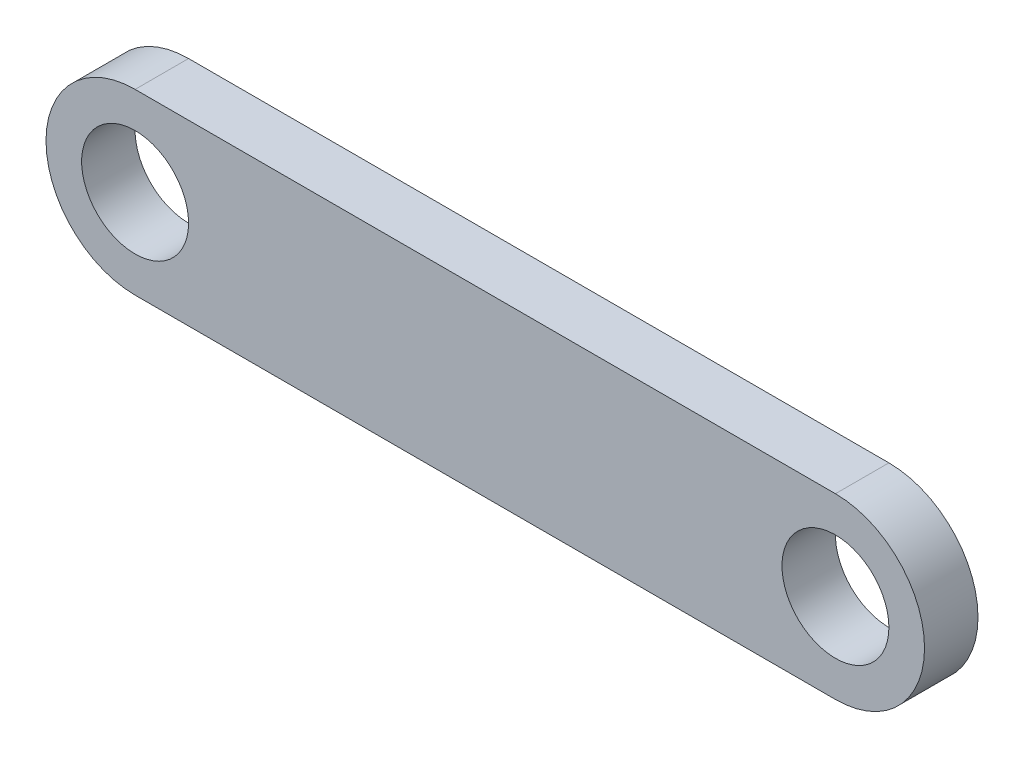
ISO-10303-21;
HEADER;
FILE_DESCRIPTION(('STEP AP214'),'2;1');
FILE_NAME('part.step','',(''),(''),'','','');
FILE_SCHEMA(('AUTOMOTIVE_DESIGN { 1 0 10303 214 1 1 1 1 }'));
ENDSEC;
DATA;
#1=APPLICATION_CONTEXT('core data for automotive mechanical design processes');
#2=APPLICATION_PROTOCOL_DEFINITION('international standard','automotive_design',2000,#1);
#3=PRODUCT_CONTEXT('',#1,'mechanical');
#4=PRODUCT('Part','Part','',(#3));
#5=PRODUCT_RELATED_PRODUCT_CATEGORY('part','',(#4));
#6=PRODUCT_DEFINITION_FORMATION('','',#4);
#7=PRODUCT_DEFINITION_CONTEXT('part definition',#1,'design');
#8=PRODUCT_DEFINITION('design','',#6,#7);
#9=PRODUCT_DEFINITION_SHAPE('','',#8);
#10=(LENGTH_UNIT() NAMED_UNIT(*) SI_UNIT(.MILLI.,.METRE.));
#11=(NAMED_UNIT(*) PLANE_ANGLE_UNIT() SI_UNIT($,.RADIAN.));
#12=(NAMED_UNIT(*) SI_UNIT($,.STERADIAN.) SOLID_ANGLE_UNIT());
#13=UNCERTAINTY_MEASURE_WITH_UNIT(LENGTH_MEASURE(1.E-05),#10,'distance_accuracy_value','');
#14=(GEOMETRIC_REPRESENTATION_CONTEXT(3) GLOBAL_UNCERTAINTY_ASSIGNED_CONTEXT((#13)) GLOBAL_UNIT_ASSIGNED_CONTEXT((#10,
#11,#12)) REPRESENTATION_CONTEXT('',''));
#15=CARTESIAN_POINT('',(0.,0.,0.));
#16=DIRECTION('',(0.,0.,1.));
#17=DIRECTION('',(1.,0.,0.));
#18=AXIS2_PLACEMENT_3D('',#15,#16,#17);
#19=CARTESIAN_POINT('',(-19.65,0.,3.));
#20=DIRECTION('',(0.,0.,1.));
#21=DIRECTION('',(1.,0.,0.));
#22=AXIS2_PLACEMENT_3D('',#19,#20,#21);
#23=PLANE('',#22);
#24=CARTESIAN_POINT('',(-19.65,0.,3.));
#25=DIRECTION('',(0.,0.,1.));
#26=DIRECTION('',(1.,0.,0.));
#27=AXIS2_PLACEMENT_3D('',#24,#25,#26);
#28=CIRCLE('',#27,3.);
#29=CARTESIAN_POINT('',(-16.65,0.,3.));
#30=VERTEX_POINT('',#29);
#31=EDGE_CURVE('E99',#30,#30,#28,.T.);
#32=ORIENTED_EDGE('',*,*,#31,.F.);
#33=EDGE_LOOP('',(#32));
#34=FACE_BOUND('',#33,.T.);
#35=CARTESIAN_POINT('',(-19.65,0.,3.));
#36=DIRECTION('',(0.,0.,1.));
#37=DIRECTION('',(1.,0.,0.));
#38=AXIS2_PLACEMENT_3D('',#35,#36,#37);
#39=CIRCLE('',#38,5.);
#40=CARTESIAN_POINT('',(-19.65,5.,3.));
#41=VERTEX_POINT('',#40);
#42=CARTESIAN_POINT('',(-19.65,-5.,3.));
#43=VERTEX_POINT('',#42);
#44=EDGE_CURVE('E84',#41,#43,#39,.T.);
#45=ORIENTED_EDGE('',*,*,#44,.T.);
#46=DIRECTION('',(1.,0.,0.));
#47=VECTOR('',#46,1.);
#48=CARTESIAN_POINT('',(-19.65,-5.,3.));
#49=LINE('',#48,#47);
#50=CARTESIAN_POINT('',(19.65,-4.99999999999999,3.));
#51=VERTEX_POINT('',#50);
#52=EDGE_CURVE('E79',#43,#51,#49,.T.);
#53=ORIENTED_EDGE('',*,*,#52,.T.);
#54=CARTESIAN_POINT('',(19.65,0.,3.));
#55=DIRECTION('',(0.,0.,1.));
#56=DIRECTION('',(1.,0.,0.));
#57=AXIS2_PLACEMENT_3D('',#54,#55,#56);
#58=CIRCLE('',#57,5.);
#59=CARTESIAN_POINT('',(19.65,5.00000000000001,3.));
#60=VERTEX_POINT('',#59);
#61=EDGE_CURVE('E82',#51,#60,#58,.T.);
#62=ORIENTED_EDGE('',*,*,#61,.T.);
#63=DIRECTION('',(-1.,0.,0.));
#64=VECTOR('',#63,1.);
#65=CARTESIAN_POINT('',(-19.65,5.,3.));
#66=LINE('',#65,#64);
#67=EDGE_CURVE('E49',#60,#41,#66,.T.);
#68=ORIENTED_EDGE('',*,*,#67,.T.);
#69=EDGE_LOOP('',(#45,#53,#62,#68));
#70=FACE_BOUND('',#69,.T.);
#71=CARTESIAN_POINT('',(19.65,0.,3.));
#72=DIRECTION('',(0.,0.,1.));
#73=DIRECTION('',(1.,0.,0.));
#74=AXIS2_PLACEMENT_3D('',#71,#72,#73);
#75=CIRCLE('',#74,2.99999999999999);
#76=CARTESIAN_POINT('',(22.65,0.,3.));
#77=VERTEX_POINT('',#76);
#78=EDGE_CURVE('E114',#77,#77,#75,.T.);
#79=ORIENTED_EDGE('',*,*,#78,.F.);
#80=EDGE_LOOP('',(#79));
#81=FACE_BOUND('',#80,.T.);
#82=ADVANCED_FACE('F32',(#34,#70,#81),#23,.T.);
#83=CARTESIAN_POINT('',(-19.65,0.,0.));
#84=DIRECTION('',(0.,0.,1.));
#85=DIRECTION('',(1.,0.,0.));
#86=AXIS2_PLACEMENT_3D('',#83,#84,#85);
#87=PLANE('',#86);
#88=CARTESIAN_POINT('',(-19.65,0.,0.));
#89=DIRECTION('',(0.,0.,1.));
#90=DIRECTION('',(1.,0.,0.));
#91=AXIS2_PLACEMENT_3D('',#88,#89,#90);
#92=CIRCLE('',#91,5.);
#93=CARTESIAN_POINT('',(-19.65,5.,0.));
#94=VERTEX_POINT('',#93);
#95=CARTESIAN_POINT('',(-19.65,-5.,0.));
#96=VERTEX_POINT('',#95);
#97=EDGE_CURVE('E96',#94,#96,#92,.T.);
#98=ORIENTED_EDGE('',*,*,#97,.F.);
#99=DIRECTION('',(-1.,0.,0.));
#100=VECTOR('',#99,1.);
#101=CARTESIAN_POINT('',(-19.65,5.,0.));
#102=LINE('',#101,#100);
#103=CARTESIAN_POINT('',(19.65,5.00000000000001,0.));
#104=VERTEX_POINT('',#103);
#105=EDGE_CURVE('E72',#104,#94,#102,.T.);
#106=ORIENTED_EDGE('',*,*,#105,.F.);
#107=CARTESIAN_POINT('',(19.65,0.,0.));
#108=DIRECTION('',(0.,0.,1.));
#109=DIRECTION('',(1.,0.,0.));
#110=AXIS2_PLACEMENT_3D('',#107,#108,#109);
#111=CIRCLE('',#110,5.);
#112=CARTESIAN_POINT('',(19.65,-4.99999999999999,0.));
#113=VERTEX_POINT('',#112);
#114=EDGE_CURVE('E66',#113,#104,#111,.T.);
#115=ORIENTED_EDGE('',*,*,#114,.F.);
#116=DIRECTION('',(1.,0.,0.));
#117=VECTOR('',#116,1.);
#118=CARTESIAN_POINT('',(-19.65,-5.,0.));
#119=LINE('',#118,#117);
#120=EDGE_CURVE('E88',#96,#113,#119,.T.);
#121=ORIENTED_EDGE('',*,*,#120,.F.);
#122=EDGE_LOOP('',(#98,#106,#115,#121));
#123=FACE_BOUND('',#122,.T.);
#124=CARTESIAN_POINT('',(-19.65,0.,0.));
#125=DIRECTION('',(0.,0.,1.));
#126=DIRECTION('',(1.,0.,0.));
#127=AXIS2_PLACEMENT_3D('',#124,#125,#126);
#128=CIRCLE('',#127,3.);
#129=CARTESIAN_POINT('',(-16.65,0.,0.));
#130=VERTEX_POINT('',#129);
#131=EDGE_CURVE('E111',#130,#130,#128,.T.);
#132=ORIENTED_EDGE('',*,*,#131,.T.);
#133=EDGE_LOOP('',(#132));
#134=FACE_BOUND('',#133,.T.);
#135=CARTESIAN_POINT('',(19.65,0.,0.));
#136=DIRECTION('',(0.,0.,1.));
#137=DIRECTION('',(1.,0.,0.));
#138=AXIS2_PLACEMENT_3D('',#135,#136,#137);
#139=CIRCLE('',#138,2.99999999999999);
#140=CARTESIAN_POINT('',(22.65,0.,0.));
#141=VERTEX_POINT('',#140);
#142=EDGE_CURVE('E117',#141,#141,#139,.T.);
#143=ORIENTED_EDGE('',*,*,#142,.T.);
#144=EDGE_LOOP('',(#143));
#145=FACE_BOUND('',#144,.T.);
#146=ADVANCED_FACE('F107',(#123,#134,#145),#87,.F.);
#147=CARTESIAN_POINT('',(-19.65,0.,3.));
#148=DIRECTION('',(0.,0.,-1.));
#149=DIRECTION('',(-1.,0.,0.));
#150=AXIS2_PLACEMENT_3D('',#147,#148,#149);
#151=CYLINDRICAL_SURFACE('',#150,5.);
#152=ORIENTED_EDGE('',*,*,#97,.T.);
#153=DIRECTION('',(0.,0.,-1.));
#154=VECTOR('',#153,1.);
#155=CARTESIAN_POINT('',(-19.65,-5.,3.));
#156=LINE('',#155,#154);
#157=EDGE_CURVE('E11',#43,#96,#156,.T.);
#158=ORIENTED_EDGE('',*,*,#157,.F.);
#159=ORIENTED_EDGE('',*,*,#44,.F.);
#160=DIRECTION('',(0.,0.,-1.));
#161=VECTOR('',#160,1.);
#162=CARTESIAN_POINT('',(-19.65,5.,3.));
#163=LINE('',#162,#161);
#164=EDGE_CURVE('E92',#41,#94,#163,.T.);
#165=ORIENTED_EDGE('',*,*,#164,.T.);
#166=EDGE_LOOP('',(#152,#158,#159,#165));
#167=FACE_BOUND('',#166,.T.);
#168=ADVANCED_FACE('F34',(#167),#151,.T.);
#169=CARTESIAN_POINT('',(-19.65,-5.,3.));
#170=DIRECTION('',(0.,1.,0.));
#171=DIRECTION('',(-1.,0.,0.));
#172=AXIS2_PLACEMENT_3D('',#169,#170,#171);
#173=PLANE('',#172);
#174=ORIENTED_EDGE('',*,*,#120,.T.);
#175=DIRECTION('',(0.,0.,-1.));
#176=VECTOR('',#175,1.);
#177=CARTESIAN_POINT('',(19.65,-4.99999999999999,3.));
#178=LINE('',#177,#176);
#179=EDGE_CURVE('E41',#51,#113,#178,.T.);
#180=ORIENTED_EDGE('',*,*,#179,.F.);
#181=ORIENTED_EDGE('',*,*,#52,.F.);
#182=ORIENTED_EDGE('',*,*,#157,.T.);
#183=EDGE_LOOP('',(#174,#180,#181,#182));
#184=FACE_BOUND('',#183,.T.);
#185=ADVANCED_FACE('F87',(#184),#173,.F.);
#186=CARTESIAN_POINT('',(19.65,0.,3.));
#187=DIRECTION('',(0.,0.,-1.));
#188=DIRECTION('',(-1.,0.,0.));
#189=AXIS2_PLACEMENT_3D('',#186,#187,#188);
#190=CYLINDRICAL_SURFACE('',#189,5.);
#191=ORIENTED_EDGE('',*,*,#114,.T.);
#192=DIRECTION('',(0.,0.,-1.));
#193=VECTOR('',#192,1.);
#194=CARTESIAN_POINT('',(19.65,5.00000000000001,3.));
#195=LINE('',#194,#193);
#196=EDGE_CURVE('E89',#60,#104,#195,.T.);
#197=ORIENTED_EDGE('',*,*,#196,.F.);
#198=ORIENTED_EDGE('',*,*,#61,.F.);
#199=ORIENTED_EDGE('',*,*,#179,.T.);
#200=EDGE_LOOP('',(#191,#197,#198,#199));
#201=FACE_BOUND('',#200,.T.);
#202=ADVANCED_FACE('F90',(#201),#190,.T.);
#203=CARTESIAN_POINT('',(-19.65,5.,3.));
#204=DIRECTION('',(0.,-1.,0.));
#205=DIRECTION('',(1.,0.,0.));
#206=AXIS2_PLACEMENT_3D('',#203,#204,#205);
#207=PLANE('',#206);
#208=ORIENTED_EDGE('',*,*,#105,.T.);
#209=ORIENTED_EDGE('',*,*,#164,.F.);
#210=ORIENTED_EDGE('',*,*,#67,.F.);
#211=ORIENTED_EDGE('',*,*,#196,.T.);
#212=EDGE_LOOP('',(#208,#209,#210,#211));
#213=FACE_BOUND('',#212,.T.);
#214=ADVANCED_FACE('F104',(#213),#207,.F.);
#215=CARTESIAN_POINT('',(-19.65,0.,3.));
#216=DIRECTION('',(0.,0.,-1.));
#217=DIRECTION('',(-1.,0.,0.));
#218=AXIS2_PLACEMENT_3D('',#215,#216,#217);
#219=CYLINDRICAL_SURFACE('',#218,3.);
#220=ORIENTED_EDGE('',*,*,#31,.T.);
#221=EDGE_LOOP('',(#220));
#222=FACE_BOUND('',#221,.T.);
#223=ORIENTED_EDGE('',*,*,#131,.F.);
#224=EDGE_LOOP('',(#223));
#225=FACE_BOUND('',#224,.T.);
#226=ADVANCED_FACE('F134',(#222,#225),#219,.F.);
#227=CARTESIAN_POINT('',(19.65,0.,3.));
#228=DIRECTION('',(0.,0.,-1.));
#229=DIRECTION('',(-1.,0.,0.));
#230=AXIS2_PLACEMENT_3D('',#227,#228,#229);
#231=CYLINDRICAL_SURFACE('',#230,2.99999999999999);
#232=ORIENTED_EDGE('',*,*,#78,.T.);
#233=EDGE_LOOP('',(#232));
#234=FACE_BOUND('',#233,.T.);
#235=ORIENTED_EDGE('',*,*,#142,.F.);
#236=EDGE_LOOP('',(#235));
#237=FACE_BOUND('',#236,.T.);
#238=ADVANCED_FACE('F123',(#234,#237),#231,.F.);
#239=CLOSED_SHELL('',(#82,#146,#168,#185,#202,#214,#226,#238));
#240=MANIFOLD_SOLID_BREP('B2',#239);
#241=ADVANCED_BREP_SHAPE_REPRESENTATION('',(#18,#240),#14);
#242=SHAPE_DEFINITION_REPRESENTATION(#9,#241);
ENDSEC;
END-ISO-10303-21;
